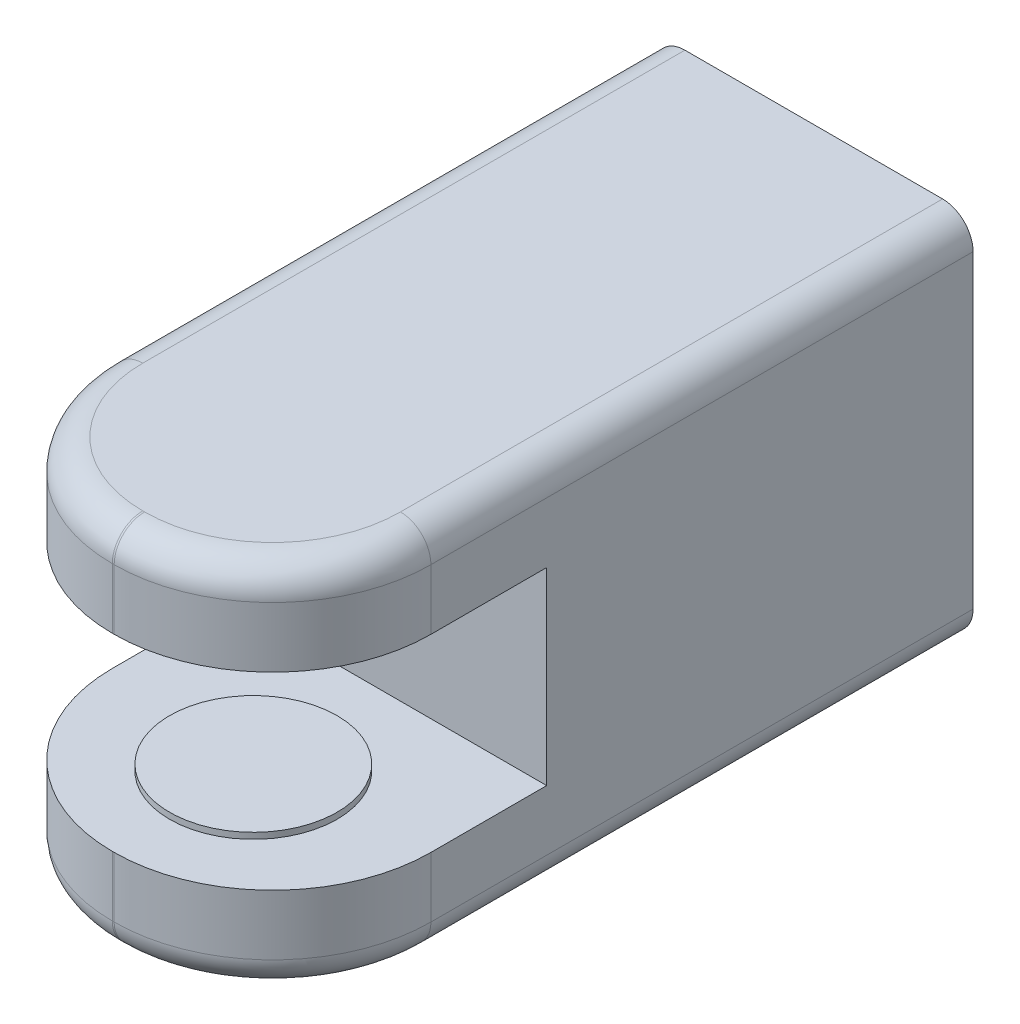
ISO-10303-21;
HEADER;
FILE_DESCRIPTION(('STEP AP214'),'2;1');
FILE_NAME('part.step','',(''),(''),'','','');
FILE_SCHEMA(('AUTOMOTIVE_DESIGN { 1 0 10303 214 1 1 1 1 }'));
ENDSEC;
DATA;
#1=APPLICATION_CONTEXT('core data for automotive mechanical design processes');
#2=APPLICATION_PROTOCOL_DEFINITION('international standard','automotive_design',2000,#1);
#3=PRODUCT_CONTEXT('',#1,'mechanical');
#4=PRODUCT('Part','Part','',(#3));
#5=PRODUCT_RELATED_PRODUCT_CATEGORY('part','',(#4));
#6=PRODUCT_DEFINITION_FORMATION('','',#4);
#7=PRODUCT_DEFINITION_CONTEXT('part definition',#1,'design');
#8=PRODUCT_DEFINITION('design','',#6,#7);
#9=PRODUCT_DEFINITION_SHAPE('','',#8);
#10=(LENGTH_UNIT() NAMED_UNIT(*) SI_UNIT(.MILLI.,.METRE.));
#11=(NAMED_UNIT(*) PLANE_ANGLE_UNIT() SI_UNIT($,.RADIAN.));
#12=(NAMED_UNIT(*) SI_UNIT($,.STERADIAN.) SOLID_ANGLE_UNIT());
#13=UNCERTAINTY_MEASURE_WITH_UNIT(LENGTH_MEASURE(1.E-05),#10,'distance_accuracy_value','');
#14=(GEOMETRIC_REPRESENTATION_CONTEXT(3) GLOBAL_UNCERTAINTY_ASSIGNED_CONTEXT((#13)) GLOBAL_UNIT_ASSIGNED_CONTEXT((#10,
#11,#12)) REPRESENTATION_CONTEXT('',''));
#15=CARTESIAN_POINT('',(0.,0.,0.));
#16=DIRECTION('',(0.,0.,1.));
#17=DIRECTION('',(1.,0.,0.));
#18=AXIS2_PLACEMENT_3D('',#15,#16,#17);
#19=CARTESIAN_POINT('',(52.305,60.805,3.00000000000002));
#20=DIRECTION('',(-1.,0.,0.));
#21=DIRECTION('',(0.,0.,1.));
#22=AXIS2_PLACEMENT_3D('',#19,#20,#21);
#23=PLANE('',#22);
#24=DIRECTION('',(0.,0.,-1.));
#25=VECTOR('',#24,1.);
#26=CARTESIAN_POINT('',(52.305,-31.,143.));
#27=LINE('',#26,#25);
#28=CARTESIAN_POINT('',(52.305,-31.,181.));
#29=VERTEX_POINT('',#28);
#30=CARTESIAN_POINT('',(52.305,-31.,143.));
#31=VERTEX_POINT('',#30);
#32=EDGE_CURVE('E160',#29,#31,#27,.T.);
#33=ORIENTED_EDGE('',*,*,#32,.F.);
#34=DIRECTION('',(0.,-1.,0.));
#35=VECTOR('',#34,1.);
#36=CARTESIAN_POINT('',(52.305,60.805,181.));
#37=LINE('',#36,#35);
#38=CARTESIAN_POINT('',(52.305,-50.805,181.));
#39=VERTEX_POINT('',#38);
#40=EDGE_CURVE('E193',#29,#39,#37,.T.);
#41=ORIENTED_EDGE('',*,*,#40,.T.);
#42=DIRECTION('',(0.,0.,-1.));
#43=VECTOR('',#42,1.);
#44=CARTESIAN_POINT('',(52.305,-50.805,3.00000000000002));
#45=LINE('',#44,#43);
#46=CARTESIAN_POINT('',(52.305,-50.805,3.00000000000002));
#47=VERTEX_POINT('',#46);
#48=EDGE_CURVE('E243',#39,#47,#45,.T.);
#49=ORIENTED_EDGE('',*,*,#48,.T.);
#50=DIRECTION('',(0.,-1.,0.));
#51=VECTOR('',#50,1.);
#52=CARTESIAN_POINT('',(52.305,60.805,3.00000000000002));
#53=LINE('',#52,#51);
#54=CARTESIAN_POINT('',(52.305,50.805,3.00000000000002));
#55=VERTEX_POINT('',#54);
#56=EDGE_CURVE('E215',#55,#47,#53,.T.);
#57=ORIENTED_EDGE('',*,*,#56,.F.);
#58=DIRECTION('',(0.,0.,-1.));
#59=VECTOR('',#58,1.);
#60=CARTESIAN_POINT('',(52.305,50.805,3.00000000000002));
#61=LINE('',#60,#59);
#62=CARTESIAN_POINT('',(52.305,50.805,181.));
#63=VERTEX_POINT('',#62);
#64=EDGE_CURVE('E246',#55,#63,#61,.F.);
#65=ORIENTED_EDGE('',*,*,#64,.T.);
#66=CARTESIAN_POINT('',(52.305,31.,181.));
#67=VERTEX_POINT('',#66);
#68=EDGE_CURVE('E198',#63,#67,#37,.T.);
#69=ORIENTED_EDGE('',*,*,#68,.T.);
#70=DIRECTION('',(0.,0.,-1.));
#71=VECTOR('',#70,1.);
#72=CARTESIAN_POINT('',(52.305,31.,143.));
#73=LINE('',#72,#71);
#74=CARTESIAN_POINT('',(52.305,31.,143.));
#75=VERTEX_POINT('',#74);
#76=EDGE_CURVE('E48',#67,#75,#73,.T.);
#77=ORIENTED_EDGE('',*,*,#76,.T.);
#78=DIRECTION('',(0.,1.,0.));
#79=VECTOR('',#78,1.);
#80=CARTESIAN_POINT('',(52.305,-31.,143.));
#81=LINE('',#80,#79);
#82=EDGE_CURVE('E175',#31,#75,#81,.T.);
#83=ORIENTED_EDGE('',*,*,#82,.F.);
#84=EDGE_LOOP('',(#33,#41,#49,#57,#65,#69,#77,#83));
#85=FACE_BOUND('',#84,.T.);
#86=ADVANCED_FACE('F33',(#85),#23,.F.);
#87=CARTESIAN_POINT('',(-52.305,60.805,3.00000000000002));
#88=DIRECTION('',(1.,0.,0.));
#89=DIRECTION('',(0.,0.,-1.));
#90=AXIS2_PLACEMENT_3D('',#87,#88,#89);
#91=PLANE('',#90);
#92=DIRECTION('',(0.,0.,1.));
#93=VECTOR('',#92,1.);
#94=CARTESIAN_POINT('',(-52.305,-31.,143.));
#95=LINE('',#94,#93);
#96=CARTESIAN_POINT('',(-52.305,-31.,143.));
#97=VERTEX_POINT('',#96);
#98=CARTESIAN_POINT('',(-52.305,-31.,181.));
#99=VERTEX_POINT('',#98);
#100=EDGE_CURVE('E317',#97,#99,#95,.T.);
#101=ORIENTED_EDGE('',*,*,#100,.F.);
#102=DIRECTION('',(0.,1.,0.));
#103=VECTOR('',#102,1.);
#104=CARTESIAN_POINT('',(-52.305,-31.,143.));
#105=LINE('',#104,#103);
#106=CARTESIAN_POINT('',(-52.305,31.,143.));
#107=VERTEX_POINT('',#106);
#108=EDGE_CURVE('E177',#97,#107,#105,.T.);
#109=ORIENTED_EDGE('',*,*,#108,.T.);
#110=DIRECTION('',(0.,0.,1.));
#111=VECTOR('',#110,1.);
#112=CARTESIAN_POINT('',(-52.305,31.,143.));
#113=LINE('',#112,#111);
#114=CARTESIAN_POINT('',(-52.305,31.,181.));
#115=VERTEX_POINT('',#114);
#116=EDGE_CURVE('E310',#107,#115,#113,.T.);
#117=ORIENTED_EDGE('',*,*,#116,.T.);
#118=DIRECTION('',(0.,-1.,0.));
#119=VECTOR('',#118,1.);
#120=CARTESIAN_POINT('',(-52.305,60.805,181.));
#121=LINE('',#120,#119);
#122=CARTESIAN_POINT('',(-52.305,50.805,181.));
#123=VERTEX_POINT('',#122);
#124=EDGE_CURVE('E209',#123,#115,#121,.T.);
#125=ORIENTED_EDGE('',*,*,#124,.F.);
#126=DIRECTION('',(0.,0.,1.));
#127=VECTOR('',#126,1.);
#128=CARTESIAN_POINT('',(-52.305,50.805,3.00000000000002));
#129=LINE('',#128,#127);
#130=CARTESIAN_POINT('',(-52.305,50.805,3.00000000000002));
#131=VERTEX_POINT('',#130);
#132=EDGE_CURVE('E275',#123,#131,#129,.F.);
#133=ORIENTED_EDGE('',*,*,#132,.T.);
#134=DIRECTION('',(0.,-1.,0.));
#135=VECTOR('',#134,1.);
#136=CARTESIAN_POINT('',(-52.305,60.805,3.00000000000002));
#137=LINE('',#136,#135);
#138=CARTESIAN_POINT('',(-52.305,-50.805,3.00000000000002));
#139=VERTEX_POINT('',#138);
#140=EDGE_CURVE('E212',#131,#139,#137,.T.);
#141=ORIENTED_EDGE('',*,*,#140,.T.);
#142=DIRECTION('',(0.,0.,1.));
#143=VECTOR('',#142,1.);
#144=CARTESIAN_POINT('',(-52.305,-50.805,181.));
#145=LINE('',#144,#143);
#146=CARTESIAN_POINT('',(-52.305,-50.805,181.));
#147=VERTEX_POINT('',#146);
#148=EDGE_CURVE('E272',#139,#147,#145,.T.);
#149=ORIENTED_EDGE('',*,*,#148,.T.);
#150=EDGE_CURVE('E208',#99,#147,#121,.T.);
#151=ORIENTED_EDGE('',*,*,#150,.F.);
#152=EDGE_LOOP('',(#101,#109,#117,#125,#133,#141,#149,#151));
#153=FACE_BOUND('',#152,.T.);
#154=ADVANCED_FACE('F318',(#153),#91,.F.);
#155=CARTESIAN_POINT('',(-0.304999999999979,60.805,181.));
#156=DIRECTION('',(0.,-1.,0.));
#157=DIRECTION('',(0.,0.,-1.));
#158=AXIS2_PLACEMENT_3D('',#155,#156,#157);
#159=CYLINDRICAL_SURFACE('',#158,52.);
#160=CARTESIAN_POINT('',(-0.304999999999979,-31.,181.));
#161=DIRECTION('',(0.,1.,0.));
#162=DIRECTION('',(0.,0.,1.));
#163=AXIS2_PLACEMENT_3D('',#160,#161,#162);
#164=CIRCLE('',#163,52.);
#165=CARTESIAN_POINT('',(-0.304999999999604,-31.,233.));
#166=VERTEX_POINT('',#165);
#167=EDGE_CURVE('E187',#99,#166,#164,.T.);
#168=ORIENTED_EDGE('',*,*,#167,.F.);
#169=ORIENTED_EDGE('',*,*,#150,.T.);
#170=CARTESIAN_POINT('',(-0.304999999999979,-50.805,181.));
#171=DIRECTION('',(0.,-1.,0.));
#172=DIRECTION('',(0.,0.,-1.));
#173=AXIS2_PLACEMENT_3D('',#170,#171,#172);
#174=CIRCLE('',#173,52.);
#175=CARTESIAN_POINT('',(-0.304999999999603,-50.805,233.));
#176=VERTEX_POINT('',#175);
#177=EDGE_CURVE('E258',#147,#176,#174,.F.);
#178=ORIENTED_EDGE('',*,*,#177,.T.);
#179=DIRECTION('',(0.,-1.,0.));
#180=VECTOR('',#179,1.);
#181=CARTESIAN_POINT('',(-0.304999999999603,60.805,233.));
#182=LINE('',#181,#180);
#183=EDGE_CURVE('E204',#166,#176,#182,.T.);
#184=ORIENTED_EDGE('',*,*,#183,.F.);
#185=EDGE_LOOP('',(#168,#169,#178,#184));
#186=FACE_BOUND('',#185,.T.);
#187=ADVANCED_FACE('F382',(#186),#159,.T.);
#188=CARTESIAN_POINT('',(0.304999999999611,60.805,233.));
#189=DIRECTION('',(0.,0.,-1.));
#190=DIRECTION('',(-1.,0.,0.));
#191=AXIS2_PLACEMENT_3D('',#188,#189,#190);
#192=PLANE('',#191);
#193=DIRECTION('',(1.,0.,0.));
#194=VECTOR('',#193,1.);
#195=CARTESIAN_POINT('',(-52.305,-31.,233.));
#196=LINE('',#195,#194);
#197=CARTESIAN_POINT('',(0.304999999999979,-31.,233.));
#198=VERTEX_POINT('',#197);
#199=EDGE_CURVE('E170',#166,#198,#196,.T.);
#200=ORIENTED_EDGE('',*,*,#199,.F.);
#201=ORIENTED_EDGE('',*,*,#183,.T.);
#202=DIRECTION('',(1.,0.,0.));
#203=VECTOR('',#202,1.);
#204=CARTESIAN_POINT('',(0.304999999999611,-50.805,233.));
#205=LINE('',#204,#203);
#206=CARTESIAN_POINT('',(0.304999999999611,-50.805,233.));
#207=VERTEX_POINT('',#206);
#208=EDGE_CURVE('E253',#176,#207,#205,.T.);
#209=ORIENTED_EDGE('',*,*,#208,.T.);
#210=DIRECTION('',(0.,-1.,0.));
#211=VECTOR('',#210,1.);
#212=CARTESIAN_POINT('',(0.304999999999611,60.805,233.));
#213=LINE('',#212,#211);
#214=EDGE_CURVE('E200',#198,#207,#213,.T.);
#215=ORIENTED_EDGE('',*,*,#214,.F.);
#216=EDGE_LOOP('',(#200,#201,#209,#215));
#217=FACE_BOUND('',#216,.T.);
#218=ADVANCED_FACE('F386',(#217),#192,.F.);
#219=CARTESIAN_POINT('',(0.304999999999979,60.805,181.));
#220=DIRECTION('',(0.,-1.,0.));
#221=DIRECTION('',(0.,0.,-1.));
#222=AXIS2_PLACEMENT_3D('',#219,#220,#221);
#223=CYLINDRICAL_SURFACE('',#222,52.);
#224=CARTESIAN_POINT('',(0.304999999999979,-31.,181.));
#225=DIRECTION('',(0.,1.,0.));
#226=DIRECTION('',(0.,0.,1.));
#227=AXIS2_PLACEMENT_3D('',#224,#225,#226);
#228=CIRCLE('',#227,52.);
#229=EDGE_CURVE('E166',#198,#29,#228,.T.);
#230=ORIENTED_EDGE('',*,*,#229,.F.);
#231=ORIENTED_EDGE('',*,*,#214,.T.);
#232=CARTESIAN_POINT('',(0.304999999999979,-50.805,181.));
#233=DIRECTION('',(0.,-1.,0.));
#234=DIRECTION('',(0.,0.,-1.));
#235=AXIS2_PLACEMENT_3D('',#232,#233,#234);
#236=CIRCLE('',#235,52.);
#237=EDGE_CURVE('E248',#207,#39,#236,.F.);
#238=ORIENTED_EDGE('',*,*,#237,.T.);
#239=ORIENTED_EDGE('',*,*,#40,.F.);
#240=EDGE_LOOP('',(#230,#231,#238,#239));
#241=FACE_BOUND('',#240,.T.);
#242=ADVANCED_FACE('F389',(#241),#223,.T.);
#243=CARTESIAN_POINT('',(0.,0.,3.));
#244=DIRECTION('',(0.,0.,-1.));
#245=DIRECTION('',(-1.,0.,0.));
#246=AXIS2_PLACEMENT_3D('',#243,#244,#245);
#247=CYLINDRICAL_SURFACE('',#246,38.5);
#248=CARTESIAN_POINT('',(0.,0.,3.));
#249=DIRECTION('',(0.,0.,1.));
#250=DIRECTION('',(1.,0.,0.));
#251=AXIS2_PLACEMENT_3D('',#248,#249,#250);
#252=CIRCLE('',#251,38.5);
#253=CARTESIAN_POINT('',(38.5,0.,3.));
#254=VERTEX_POINT('',#253);
#255=EDGE_CURVE('E219',#254,#254,#252,.T.);
#256=ORIENTED_EDGE('',*,*,#255,.F.);
#257=EDGE_LOOP('',(#256));
#258=FACE_BOUND('',#257,.T.);
#259=CARTESIAN_POINT('',(0.,0.,0.));
#260=DIRECTION('',(0.,0.,1.));
#261=DIRECTION('',(1.,0.,0.));
#262=AXIS2_PLACEMENT_3D('',#259,#260,#261);
#263=CIRCLE('',#262,38.5);
#264=CARTESIAN_POINT('',(38.5,0.,0.));
#265=VERTEX_POINT('',#264);
#266=EDGE_CURVE('E218',#265,#265,#263,.T.);
#267=ORIENTED_EDGE('',*,*,#266,.T.);
#268=EDGE_LOOP('',(#267));
#269=FACE_BOUND('',#268,.T.);
#270=ADVANCED_FACE('F419',(#258,#269),#247,.T.);
#271=CARTESIAN_POINT('',(0.,0.,0.));
#272=DIRECTION('',(0.,0.,1.));
#273=DIRECTION('',(1.,0.,0.));
#274=AXIS2_PLACEMENT_3D('',#271,#272,#273);
#275=PLANE('',#274);
#276=ORIENTED_EDGE('',*,*,#266,.F.);
#277=EDGE_LOOP('',(#276));
#278=FACE_BOUND('',#277,.T.);
#279=ADVANCED_FACE('F416',(#278),#275,.F.);
#280=CARTESIAN_POINT('',(52.305,60.805,3.00000000000002));
#281=DIRECTION('',(0.,0.,1.));
#282=DIRECTION('',(1.,0.,0.));
#283=AXIS2_PLACEMENT_3D('',#280,#281,#282);
#284=PLANE('',#283);
#285=ORIENTED_EDGE('',*,*,#255,.T.);
#286=EDGE_LOOP('',(#285));
#287=FACE_BOUND('',#286,.T.);
#288=DIRECTION('',(-1.,0.,0.));
#289=VECTOR('',#288,1.);
#290=CARTESIAN_POINT('',(52.305,60.805,3.00000000000002));
#291=LINE('',#290,#289);
#292=CARTESIAN_POINT('',(42.305,60.805,3.00000000000002));
#293=VERTEX_POINT('',#292);
#294=CARTESIAN_POINT('',(-42.305,60.805,3.00000000000002));
#295=VERTEX_POINT('',#294);
#296=EDGE_CURVE('E190',#293,#295,#291,.T.);
#297=ORIENTED_EDGE('',*,*,#296,.F.);
#298=CARTESIAN_POINT('',(42.305,50.805,3.00000000000003));
#299=DIRECTION('',(0.,0.,1.));
#300=DIRECTION('',(1.,0.,0.));
#301=AXIS2_PLACEMENT_3D('',#298,#299,#300);
#302=CIRCLE('',#301,10.);
#303=EDGE_CURVE('E241',#293,#55,#302,.F.);
#304=ORIENTED_EDGE('',*,*,#303,.T.);
#305=ORIENTED_EDGE('',*,*,#56,.T.);
#306=CARTESIAN_POINT('',(42.305,-50.805,3.00000000000002));
#307=DIRECTION('',(0.,0.,1.));
#308=DIRECTION('',(1.,0.,0.));
#309=AXIS2_PLACEMENT_3D('',#306,#307,#308);
#310=CIRCLE('',#309,10.);
#311=CARTESIAN_POINT('',(42.305,-60.805,3.00000000000002));
#312=VERTEX_POINT('',#311);
#313=EDGE_CURVE('E239',#47,#312,#310,.F.);
#314=ORIENTED_EDGE('',*,*,#313,.T.);
#315=DIRECTION('',(-1.,0.,0.));
#316=VECTOR('',#315,1.);
#317=CARTESIAN_POINT('',(52.305,-60.805,3.00000000000002));
#318=LINE('',#317,#316);
#319=CARTESIAN_POINT('',(-42.305,-60.805,3.00000000000002));
#320=VERTEX_POINT('',#319);
#321=EDGE_CURVE('E194',#312,#320,#318,.T.);
#322=ORIENTED_EDGE('',*,*,#321,.T.);
#323=CARTESIAN_POINT('',(-42.305,-50.805,3.00000000000002));
#324=DIRECTION('',(0.,0.,1.));
#325=DIRECTION('',(1.,0.,0.));
#326=AXIS2_PLACEMENT_3D('',#323,#324,#325);
#327=CIRCLE('',#326,10.);
#328=EDGE_CURVE('E235',#320,#139,#327,.F.);
#329=ORIENTED_EDGE('',*,*,#328,.T.);
#330=ORIENTED_EDGE('',*,*,#140,.F.);
#331=CARTESIAN_POINT('',(-42.305,50.805,3.00000000000003));
#332=DIRECTION('',(0.,0.,1.));
#333=DIRECTION('',(1.,0.,0.));
#334=AXIS2_PLACEMENT_3D('',#331,#332,#333);
#335=CIRCLE('',#334,10.);
#336=EDGE_CURVE('E237',#131,#295,#335,.F.);
#337=ORIENTED_EDGE('',*,*,#336,.T.);
#338=EDGE_LOOP('',(#297,#304,#305,#314,#322,#329,#330,#337));
#339=FACE_BOUND('',#338,.T.);
#340=ADVANCED_FACE('F351',(#287,#339),#284,.F.);
#341=ORIENTED_EDGE('',*,*,#124,.T.);
#342=CARTESIAN_POINT('',(-0.304999999999979,31.,181.));
#343=DIRECTION('',(0.,1.,0.));
#344=DIRECTION('',(0.,0.,1.));
#345=AXIS2_PLACEMENT_3D('',#342,#343,#344);
#346=CIRCLE('',#345,52.);
#347=CARTESIAN_POINT('',(-0.304999999999604,31.,233.));
#348=VERTEX_POINT('',#347);
#349=EDGE_CURVE('E181',#115,#348,#346,.T.);
#350=ORIENTED_EDGE('',*,*,#349,.T.);
#351=CARTESIAN_POINT('',(-0.304999999999603,50.805,233.));
#352=VERTEX_POINT('',#351);
#353=EDGE_CURVE('E205',#352,#348,#182,.T.);
#354=ORIENTED_EDGE('',*,*,#353,.F.);
#355=CARTESIAN_POINT('',(-0.304999999999979,50.805,181.));
#356=DIRECTION('',(0.,-1.,0.));
#357=DIRECTION('',(0.,0.,-1.));
#358=AXIS2_PLACEMENT_3D('',#355,#356,#357);
#359=CIRCLE('',#358,52.);
#360=EDGE_CURVE('E261',#352,#123,#359,.T.);
#361=ORIENTED_EDGE('',*,*,#360,.T.);
#362=EDGE_LOOP('',(#341,#350,#354,#361));
#363=FACE_BOUND('',#362,.T.);
#364=ADVANCED_FACE('F368',(#363),#159,.T.);
#365=ORIENTED_EDGE('',*,*,#353,.T.);
#366=DIRECTION('',(1.,0.,0.));
#367=VECTOR('',#366,1.);
#368=CARTESIAN_POINT('',(-52.305,31.,233.));
#369=LINE('',#368,#367);
#370=CARTESIAN_POINT('',(0.304999999999979,31.,233.));
#371=VERTEX_POINT('',#370);
#372=EDGE_CURVE('E314',#348,#371,#369,.T.);
#373=ORIENTED_EDGE('',*,*,#372,.T.);
#374=CARTESIAN_POINT('',(0.304999999999611,50.805,233.));
#375=VERTEX_POINT('',#374);
#376=EDGE_CURVE('E201',#375,#371,#213,.T.);
#377=ORIENTED_EDGE('',*,*,#376,.F.);
#378=DIRECTION('',(1.,0.,0.));
#379=VECTOR('',#378,1.);
#380=CARTESIAN_POINT('',(0.304999999999611,50.805,233.));
#381=LINE('',#380,#379);
#382=EDGE_CURVE('E256',#375,#352,#381,.F.);
#383=ORIENTED_EDGE('',*,*,#382,.T.);
#384=EDGE_LOOP('',(#365,#373,#377,#383));
#385=FACE_BOUND('',#384,.T.);
#386=ADVANCED_FACE('F330',(#385),#192,.F.);
#387=ORIENTED_EDGE('',*,*,#376,.T.);
#388=CARTESIAN_POINT('',(0.304999999999979,31.,181.));
#389=DIRECTION('',(0.,1.,0.));
#390=DIRECTION('',(0.,0.,1.));
#391=AXIS2_PLACEMENT_3D('',#388,#389,#390);
#392=CIRCLE('',#391,52.);
#393=EDGE_CURVE('E277',#371,#67,#392,.T.);
#394=ORIENTED_EDGE('',*,*,#393,.T.);
#395=ORIENTED_EDGE('',*,*,#68,.F.);
#396=CARTESIAN_POINT('',(0.304999999999979,50.805,181.));
#397=DIRECTION('',(0.,-1.,0.));
#398=DIRECTION('',(0.,0.,-1.));
#399=AXIS2_PLACEMENT_3D('',#396,#397,#398);
#400=CIRCLE('',#399,52.);
#401=EDGE_CURVE('E251',#63,#375,#400,.T.);
#402=ORIENTED_EDGE('',*,*,#401,.T.);
#403=EDGE_LOOP('',(#387,#394,#395,#402));
#404=FACE_BOUND('',#403,.T.);
#405=ADVANCED_FACE('F334',(#404),#223,.T.);
#406=CARTESIAN_POINT('',(0.304999999999979,60.805,181.));
#407=DIRECTION('',(0.,-1.,0.));
#408=DIRECTION('',(0.,0.,-1.));
#409=AXIS2_PLACEMENT_3D('',#406,#407,#408);
#410=PLANE('',#409);
#411=CARTESIAN_POINT('',(0.304999999999979,60.805,181.));
#412=DIRECTION('',(0.,-1.,0.));
#413=DIRECTION('',(0.,0.,-1.));
#414=AXIS2_PLACEMENT_3D('',#411,#412,#413);
#415=CIRCLE('',#414,42.);
#416=CARTESIAN_POINT('',(0.304999999999682,60.805,223.));
#417=VERTEX_POINT('',#416);
#418=CARTESIAN_POINT('',(42.305,60.805,181.));
#419=VERTEX_POINT('',#418);
#420=EDGE_CURVE('E230',#417,#419,#415,.F.);
#421=ORIENTED_EDGE('',*,*,#420,.T.);
#422=DIRECTION('',(0.,0.,-1.));
#423=VECTOR('',#422,1.);
#424=CARTESIAN_POINT('',(42.305,60.805,181.));
#425=LINE('',#424,#423);
#426=EDGE_CURVE('E232',#419,#293,#425,.T.);
#427=ORIENTED_EDGE('',*,*,#426,.T.);
#428=ORIENTED_EDGE('',*,*,#296,.T.);
#429=DIRECTION('',(0.,0.,1.));
#430=VECTOR('',#429,1.);
#431=CARTESIAN_POINT('',(-42.305,60.805,181.));
#432=LINE('',#431,#430);
#433=CARTESIAN_POINT('',(-42.305,60.805,181.));
#434=VERTEX_POINT('',#433);
#435=EDGE_CURVE('E222',#295,#434,#432,.T.);
#436=ORIENTED_EDGE('',*,*,#435,.T.);
#437=CARTESIAN_POINT('',(-0.304999999999979,60.805,181.));
#438=DIRECTION('',(0.,-1.,0.));
#439=DIRECTION('',(0.,0.,-1.));
#440=AXIS2_PLACEMENT_3D('',#437,#438,#439);
#441=CIRCLE('',#440,42.);
#442=CARTESIAN_POINT('',(-0.304999999999603,60.805,223.));
#443=VERTEX_POINT('',#442);
#444=EDGE_CURVE('E226',#434,#443,#441,.F.);
#445=ORIENTED_EDGE('',*,*,#444,.T.);
#446=DIRECTION('',(1.,0.,0.));
#447=VECTOR('',#446,1.);
#448=CARTESIAN_POINT('',(0.304999999999979,60.805,223.));
#449=LINE('',#448,#447);
#450=EDGE_CURVE('E228',#443,#417,#449,.T.);
#451=ORIENTED_EDGE('',*,*,#450,.T.);
#452=EDGE_LOOP('',(#421,#427,#428,#436,#445,#451));
#453=FACE_BOUND('',#452,.T.);
#454=ADVANCED_FACE('F348',(#453),#410,.F.);
#455=CARTESIAN_POINT('',(0.304999999999979,-60.805,181.));
#456=DIRECTION('',(0.,-1.,0.));
#457=DIRECTION('',(0.,0.,-1.));
#458=AXIS2_PLACEMENT_3D('',#455,#456,#457);
#459=PLANE('',#458);
#460=ORIENTED_EDGE('',*,*,#321,.F.);
#461=DIRECTION('',(0.,0.,-1.));
#462=VECTOR('',#461,1.);
#463=CARTESIAN_POINT('',(42.305,-60.805,181.));
#464=LINE('',#463,#462);
#465=CARTESIAN_POINT('',(42.305,-60.805,181.));
#466=VERTEX_POINT('',#465);
#467=EDGE_CURVE('E56',#312,#466,#464,.F.);
#468=ORIENTED_EDGE('',*,*,#467,.T.);
#469=CARTESIAN_POINT('',(0.304999999999979,-60.805,181.));
#470=DIRECTION('',(0.,-1.,0.));
#471=DIRECTION('',(0.,0.,-1.));
#472=AXIS2_PLACEMENT_3D('',#469,#470,#471);
#473=CIRCLE('',#472,42.);
#474=CARTESIAN_POINT('',(0.304999999999682,-60.805,223.));
#475=VERTEX_POINT('',#474);
#476=EDGE_CURVE('E269',#466,#475,#473,.T.);
#477=ORIENTED_EDGE('',*,*,#476,.T.);
#478=DIRECTION('',(1.,0.,0.));
#479=VECTOR('',#478,1.);
#480=CARTESIAN_POINT('',(-0.304999999999603,-60.805,223.));
#481=LINE('',#480,#479);
#482=CARTESIAN_POINT('',(-0.304999999999603,-60.805,223.));
#483=VERTEX_POINT('',#482);
#484=EDGE_CURVE('E267',#475,#483,#481,.F.);
#485=ORIENTED_EDGE('',*,*,#484,.T.);
#486=CARTESIAN_POINT('',(-0.304999999999979,-60.805,181.));
#487=DIRECTION('',(0.,-1.,0.));
#488=DIRECTION('',(0.,0.,-1.));
#489=AXIS2_PLACEMENT_3D('',#486,#487,#488);
#490=CIRCLE('',#489,42.);
#491=CARTESIAN_POINT('',(-42.305,-60.805,181.));
#492=VERTEX_POINT('',#491);
#493=EDGE_CURVE('E265',#483,#492,#490,.T.);
#494=ORIENTED_EDGE('',*,*,#493,.T.);
#495=DIRECTION('',(0.,0.,1.));
#496=VECTOR('',#495,1.);
#497=CARTESIAN_POINT('',(-42.305,-60.805,3.00000000000002));
#498=LINE('',#497,#496);
#499=EDGE_CURVE('E263',#492,#320,#498,.F.);
#500=ORIENTED_EDGE('',*,*,#499,.T.);
#501=EDGE_LOOP('',(#460,#468,#477,#485,#494,#500));
#502=FACE_BOUND('',#501,.T.);
#503=ADVANCED_FACE('F394',(#502),#459,.T.);
#504=CARTESIAN_POINT('',(-42.305,50.805,181.));
#505=DIRECTION('',(0.,0.,1.));
#506=DIRECTION('',(1.,0.,0.));
#507=AXIS2_PLACEMENT_3D('',#504,#505,#506);
#508=CYLINDRICAL_SURFACE('',#507,10.);
#509=ORIENTED_EDGE('',*,*,#336,.F.);
#510=ORIENTED_EDGE('',*,*,#132,.F.);
#511=CARTESIAN_POINT('',(-42.305,50.805,181.));
#512=DIRECTION('',(0.,0.,1.));
#513=DIRECTION('',(1.,0.,0.));
#514=AXIS2_PLACEMENT_3D('',#511,#512,#513);
#515=CIRCLE('',#514,10.);
#516=EDGE_CURVE('E197',#434,#123,#515,.T.);
#517=ORIENTED_EDGE('',*,*,#516,.F.);
#518=ORIENTED_EDGE('',*,*,#435,.F.);
#519=EDGE_LOOP('',(#509,#510,#517,#518));
#520=FACE_BOUND('',#519,.T.);
#521=ADVANCED_FACE('F357',(#520),#508,.T.);
#522=CARTESIAN_POINT('',(-0.304999999999979,50.805,181.));
#523=DIRECTION('',(0.,-1.,0.));
#524=DIRECTION('',(0.,0.,-1.));
#525=AXIS2_PLACEMENT_3D('',#522,#523,#524);
#526=TOROIDAL_SURFACE('',#525,42.,10.);
#527=ORIENTED_EDGE('',*,*,#516,.T.);
#528=ORIENTED_EDGE('',*,*,#360,.F.);
#529=CARTESIAN_POINT('',(-0.304999999999603,50.805,223.));
#530=DIRECTION('',(1.,0.,0.));
#531=DIRECTION('',(0.,0.,-1.));
#532=AXIS2_PLACEMENT_3D('',#529,#530,#531);
#533=CIRCLE('',#532,10.);
#534=EDGE_CURVE('E285',#443,#352,#533,.T.);
#535=ORIENTED_EDGE('',*,*,#534,.F.);
#536=ORIENTED_EDGE('',*,*,#444,.F.);
#537=EDGE_LOOP('',(#527,#528,#535,#536));
#538=FACE_BOUND('',#537,.T.);
#539=ADVANCED_FACE('F364',(#538),#526,.T.);
#540=CARTESIAN_POINT('',(0.304999999999979,50.805,223.));
#541=DIRECTION('',(1.,0.,0.));
#542=DIRECTION('',(0.,0.,-1.));
#543=AXIS2_PLACEMENT_3D('',#540,#541,#542);
#544=CYLINDRICAL_SURFACE('',#543,10.);
#545=ORIENTED_EDGE('',*,*,#534,.T.);
#546=ORIENTED_EDGE('',*,*,#382,.F.);
#547=CARTESIAN_POINT('',(0.304999999999682,50.805,223.));
#548=DIRECTION('',(1.,0.,0.));
#549=DIRECTION('',(0.,0.,-1.));
#550=AXIS2_PLACEMENT_3D('',#547,#548,#549);
#551=CIRCLE('',#550,10.);
#552=EDGE_CURVE('E281',#417,#375,#551,.T.);
#553=ORIENTED_EDGE('',*,*,#552,.F.);
#554=ORIENTED_EDGE('',*,*,#450,.F.);
#555=EDGE_LOOP('',(#545,#546,#553,#554));
#556=FACE_BOUND('',#555,.T.);
#557=ADVANCED_FACE('F366',(#556),#544,.T.);
#558=CARTESIAN_POINT('',(0.304999999999979,50.805,181.));
#559=DIRECTION('',(0.,-1.,0.));
#560=DIRECTION('',(0.,0.,-1.));
#561=AXIS2_PLACEMENT_3D('',#558,#559,#560);
#562=TOROIDAL_SURFACE('',#561,42.,10.);
#563=ORIENTED_EDGE('',*,*,#552,.T.);
#564=ORIENTED_EDGE('',*,*,#401,.F.);
#565=CARTESIAN_POINT('',(42.305,50.805,181.));
#566=DIRECTION('',(0.,0.,-1.));
#567=DIRECTION('',(-1.,0.,0.));
#568=AXIS2_PLACEMENT_3D('',#565,#566,#567);
#569=CIRCLE('',#568,10.);
#570=EDGE_CURVE('E278',#419,#63,#569,.T.);
#571=ORIENTED_EDGE('',*,*,#570,.F.);
#572=ORIENTED_EDGE('',*,*,#420,.F.);
#573=EDGE_LOOP('',(#563,#564,#571,#572));
#574=FACE_BOUND('',#573,.T.);
#575=ADVANCED_FACE('F339',(#574),#562,.T.);
#576=CARTESIAN_POINT('',(42.305,50.805,181.));
#577=DIRECTION('',(0.,0.,-1.));
#578=DIRECTION('',(-1.,0.,0.));
#579=AXIS2_PLACEMENT_3D('',#576,#577,#578);
#580=CYLINDRICAL_SURFACE('',#579,10.);
#581=ORIENTED_EDGE('',*,*,#570,.T.);
#582=ORIENTED_EDGE('',*,*,#64,.F.);
#583=ORIENTED_EDGE('',*,*,#303,.F.);
#584=ORIENTED_EDGE('',*,*,#426,.F.);
#585=EDGE_LOOP('',(#581,#582,#583,#584));
#586=FACE_BOUND('',#585,.T.);
#587=ADVANCED_FACE('F345',(#586),#580,.T.);
#588=CARTESIAN_POINT('',(-42.305,-50.805,3.00000000000002));
#589=DIRECTION('',(0.,0.,-1.));
#590=DIRECTION('',(-1.,0.,0.));
#591=AXIS2_PLACEMENT_3D('',#588,#589,#590);
#592=CYLINDRICAL_SURFACE('',#591,10.);
#593=ORIENTED_EDGE('',*,*,#328,.F.);
#594=ORIENTED_EDGE('',*,*,#499,.F.);
#595=CARTESIAN_POINT('',(-42.305,-50.805,181.));
#596=DIRECTION('',(0.,0.,1.));
#597=DIRECTION('',(0.,-1.,0.));
#598=AXIS2_PLACEMENT_3D('',#595,#596,#597);
#599=CIRCLE('',#598,10.);
#600=EDGE_CURVE('E282',#147,#492,#599,.T.);
#601=ORIENTED_EDGE('',*,*,#600,.F.);
#602=ORIENTED_EDGE('',*,*,#148,.F.);
#603=EDGE_LOOP('',(#593,#594,#601,#602));
#604=FACE_BOUND('',#603,.T.);
#605=ADVANCED_FACE('F35',(#604),#592,.T.);
#606=CARTESIAN_POINT('',(-0.304999999999979,-50.805,181.));
#607=DIRECTION('',(0.,-1.,0.));
#608=DIRECTION('',(0.,0.,-1.));
#609=AXIS2_PLACEMENT_3D('',#606,#607,#608);
#610=TOROIDAL_SURFACE('',#609,42.,10.);
#611=ORIENTED_EDGE('',*,*,#600,.T.);
#612=ORIENTED_EDGE('',*,*,#493,.F.);
#613=CARTESIAN_POINT('',(-0.304999999999675,-50.805,223.));
#614=DIRECTION('',(1.,0.,0.));
#615=DIRECTION('',(0.,1.,0.));
#616=AXIS2_PLACEMENT_3D('',#613,#614,#615);
#617=CIRCLE('',#616,10.);
#618=EDGE_CURVE('E295',#176,#483,#617,.T.);
#619=ORIENTED_EDGE('',*,*,#618,.F.);
#620=ORIENTED_EDGE('',*,*,#177,.F.);
#621=EDGE_LOOP('',(#611,#612,#619,#620));
#622=FACE_BOUND('',#621,.T.);
#623=ADVANCED_FACE('F378',(#622),#610,.T.);
#624=CARTESIAN_POINT('',(0.304999999999611,-50.805,223.));
#625=DIRECTION('',(-1.,0.,0.));
#626=DIRECTION('',(0.,0.,1.));
#627=AXIS2_PLACEMENT_3D('',#624,#625,#626);
#628=CYLINDRICAL_SURFACE('',#627,10.);
#629=ORIENTED_EDGE('',*,*,#618,.T.);
#630=ORIENTED_EDGE('',*,*,#484,.F.);
#631=CARTESIAN_POINT('',(0.304999999999611,-50.805,223.));
#632=DIRECTION('',(1.,0.,0.));
#633=DIRECTION('',(0.,1.,0.));
#634=AXIS2_PLACEMENT_3D('',#631,#632,#633);
#635=CIRCLE('',#634,10.);
#636=EDGE_CURVE('E292',#207,#475,#635,.T.);
#637=ORIENTED_EDGE('',*,*,#636,.F.);
#638=ORIENTED_EDGE('',*,*,#208,.F.);
#639=EDGE_LOOP('',(#629,#630,#637,#638));
#640=FACE_BOUND('',#639,.T.);
#641=ADVANCED_FACE('F400',(#640),#628,.T.);
#642=CARTESIAN_POINT('',(0.304999999999979,-50.805,181.));
#643=DIRECTION('',(0.,-1.,0.));
#644=DIRECTION('',(0.,0.,-1.));
#645=AXIS2_PLACEMENT_3D('',#642,#643,#644);
#646=TOROIDAL_SURFACE('',#645,42.,10.);
#647=ORIENTED_EDGE('',*,*,#636,.T.);
#648=ORIENTED_EDGE('',*,*,#476,.F.);
#649=CARTESIAN_POINT('',(42.305,-50.805,181.));
#650=DIRECTION('',(0.,0.,-1.));
#651=DIRECTION('',(-1.,0.,0.));
#652=AXIS2_PLACEMENT_3D('',#649,#650,#651);
#653=CIRCLE('',#652,10.);
#654=EDGE_CURVE('E189',#39,#466,#653,.T.);
#655=ORIENTED_EDGE('',*,*,#654,.F.);
#656=ORIENTED_EDGE('',*,*,#237,.F.);
#657=EDGE_LOOP('',(#647,#648,#655,#656));
#658=FACE_BOUND('',#657,.T.);
#659=ADVANCED_FACE('F397',(#658),#646,.T.);
#660=CARTESIAN_POINT('',(42.305,-50.805,3.00000000000002));
#661=DIRECTION('',(0.,0.,1.));
#662=DIRECTION('',(1.,0.,0.));
#663=AXIS2_PLACEMENT_3D('',#660,#661,#662);
#664=CYLINDRICAL_SURFACE('',#663,10.);
#665=ORIENTED_EDGE('',*,*,#654,.T.);
#666=ORIENTED_EDGE('',*,*,#467,.F.);
#667=ORIENTED_EDGE('',*,*,#313,.F.);
#668=ORIENTED_EDGE('',*,*,#48,.F.);
#669=EDGE_LOOP('',(#665,#666,#667,#668));
#670=FACE_BOUND('',#669,.T.);
#671=ADVANCED_FACE('F395',(#670),#664,.T.);
#672=CARTESIAN_POINT('',(0.,-31.,0.));
#673=DIRECTION('',(0.,1.,0.));
#674=DIRECTION('',(0.,0.,1.));
#675=AXIS2_PLACEMENT_3D('',#672,#673,#674);
#676=PLANE('',#675);
#677=CARTESIAN_POINT('',(0.,-31.,187.));
#678=DIRECTION('',(0.,1.,0.));
#679=DIRECTION('',(0.,0.,1.));
#680=AXIS2_PLACEMENT_3D('',#677,#678,#679);
#681=CIRCLE('',#680,27.5);
#682=CARTESIAN_POINT('',(0.,-31.,214.5));
#683=VERTEX_POINT('',#682);
#684=EDGE_CURVE('E11',#683,#683,#681,.T.);
#685=ORIENTED_EDGE('',*,*,#684,.F.);
#686=EDGE_LOOP('',(#685));
#687=FACE_BOUND('',#686,.T.);
#688=ORIENTED_EDGE('',*,*,#167,.T.);
#689=ORIENTED_EDGE('',*,*,#199,.T.);
#690=ORIENTED_EDGE('',*,*,#229,.T.);
#691=ORIENTED_EDGE('',*,*,#32,.T.);
#692=DIRECTION('',(-1.,0.,0.));
#693=VECTOR('',#692,1.);
#694=CARTESIAN_POINT('',(-52.305,-31.,143.));
#695=LINE('',#694,#693);
#696=EDGE_CURVE('E163',#31,#97,#695,.T.);
#697=ORIENTED_EDGE('',*,*,#696,.T.);
#698=ORIENTED_EDGE('',*,*,#100,.T.);
#699=EDGE_LOOP('',(#688,#689,#690,#691,#697,#698));
#700=FACE_BOUND('',#699,.T.);
#701=ADVANCED_FACE('F162',(#687,#700),#676,.T.);
#702=CARTESIAN_POINT('',(0.,31.,0.));
#703=DIRECTION('',(0.,1.,0.));
#704=DIRECTION('',(0.,0.,1.));
#705=AXIS2_PLACEMENT_3D('',#702,#703,#704);
#706=PLANE('',#705);
#707=CARTESIAN_POINT('',(0.,31.,187.));
#708=DIRECTION('',(0.,1.,0.));
#709=DIRECTION('',(0.,0.,1.));
#710=AXIS2_PLACEMENT_3D('',#707,#708,#709);
#711=CIRCLE('',#710,27.5);
#712=CARTESIAN_POINT('',(0.,31.,214.5));
#713=VERTEX_POINT('',#712);
#714=EDGE_CURVE('E41',#713,#713,#711,.F.);
#715=ORIENTED_EDGE('',*,*,#714,.F.);
#716=EDGE_LOOP('',(#715));
#717=FACE_BOUND('',#716,.T.);
#718=ORIENTED_EDGE('',*,*,#116,.F.);
#719=DIRECTION('',(-1.,0.,0.));
#720=VECTOR('',#719,1.);
#721=CARTESIAN_POINT('',(-52.305,31.,143.));
#722=LINE('',#721,#720);
#723=EDGE_CURVE('E311',#75,#107,#722,.T.);
#724=ORIENTED_EDGE('',*,*,#723,.F.);
#725=ORIENTED_EDGE('',*,*,#76,.F.);
#726=ORIENTED_EDGE('',*,*,#393,.F.);
#727=ORIENTED_EDGE('',*,*,#372,.F.);
#728=ORIENTED_EDGE('',*,*,#349,.F.);
#729=EDGE_LOOP('',(#718,#724,#725,#726,#727,#728));
#730=FACE_BOUND('',#729,.T.);
#731=ADVANCED_FACE('F306',(#717,#730),#706,.F.);
#732=CARTESIAN_POINT('',(-52.305,-31.,143.));
#733=DIRECTION('',(0.,0.,-1.));
#734=DIRECTION('',(-1.,0.,0.));
#735=AXIS2_PLACEMENT_3D('',#732,#733,#734);
#736=PLANE('',#735);
#737=ORIENTED_EDGE('',*,*,#723,.T.);
#738=ORIENTED_EDGE('',*,*,#108,.F.);
#739=ORIENTED_EDGE('',*,*,#696,.F.);
#740=ORIENTED_EDGE('',*,*,#82,.T.);
#741=EDGE_LOOP('',(#737,#738,#739,#740));
#742=FACE_BOUND('',#741,.T.);
#743=ADVANCED_FACE('F174',(#742),#736,.F.);
#744=CARTESIAN_POINT('',(0.,29.,187.));
#745=DIRECTION('',(0.,1.,0.));
#746=DIRECTION('',(0.,0.,1.));
#747=AXIS2_PLACEMENT_3D('',#744,#745,#746);
#748=CYLINDRICAL_SURFACE('',#747,27.5);
#749=CARTESIAN_POINT('',(0.,29.,187.));
#750=DIRECTION('',(0.,-1.,0.));
#751=DIRECTION('',(0.,0.,-1.));
#752=AXIS2_PLACEMENT_3D('',#749,#750,#751);
#753=CIRCLE('',#752,27.5);
#754=CARTESIAN_POINT('',(0.,29.,159.5));
#755=VERTEX_POINT('',#754);
#756=EDGE_CURVE('E315',#755,#755,#753,.T.);
#757=ORIENTED_EDGE('',*,*,#756,.F.);
#758=EDGE_LOOP('',(#757));
#759=FACE_BOUND('',#758,.T.);
#760=ORIENTED_EDGE('',*,*,#714,.T.);
#761=EDGE_LOOP('',(#760));
#762=FACE_BOUND('',#761,.T.);
#763=ADVANCED_FACE('F304',(#759,#762),#748,.T.);
#764=CARTESIAN_POINT('',(0.,29.,187.));
#765=DIRECTION('',(0.,-1.,0.));
#766=DIRECTION('',(0.,0.,-1.));
#767=AXIS2_PLACEMENT_3D('',#764,#765,#766);
#768=PLANE('',#767);
#769=ORIENTED_EDGE('',*,*,#756,.T.);
#770=EDGE_LOOP('',(#769));
#771=FACE_BOUND('',#770,.T.);
#772=ADVANCED_FACE('F600',(#771),#768,.T.);
#773=CARTESIAN_POINT('',(0.,-29.,187.));
#774=DIRECTION('',(0.,-1.,0.));
#775=DIRECTION('',(0.,0.,-1.));
#776=AXIS2_PLACEMENT_3D('',#773,#774,#775);
#777=CYLINDRICAL_SURFACE('',#776,27.5);
#778=CARTESIAN_POINT('',(0.,-29.,187.));
#779=DIRECTION('',(0.,-1.,0.));
#780=DIRECTION('',(0.,0.,-1.));
#781=AXIS2_PLACEMENT_3D('',#778,#779,#780);
#782=CIRCLE('',#781,27.5);
#783=CARTESIAN_POINT('',(0.,-29.,159.5));
#784=VERTEX_POINT('',#783);
#785=EDGE_CURVE('E633',#784,#784,#782,.T.);
#786=ORIENTED_EDGE('',*,*,#785,.T.);
#787=EDGE_LOOP('',(#786));
#788=FACE_BOUND('',#787,.T.);
#789=ORIENTED_EDGE('',*,*,#684,.T.);
#790=EDGE_LOOP('',(#789));
#791=FACE_BOUND('',#790,.T.);
#792=ADVANCED_FACE('F607',(#788,#791),#777,.T.);
#793=CARTESIAN_POINT('',(0.,-29.,187.));
#794=DIRECTION('',(0.,1.,0.));
#795=DIRECTION('',(0.,0.,-1.));
#796=AXIS2_PLACEMENT_3D('',#793,#794,#795);
#797=PLANE('',#796);
#798=ORIENTED_EDGE('',*,*,#785,.F.);
#799=EDGE_LOOP('',(#798));
#800=FACE_BOUND('',#799,.T.);
#801=ADVANCED_FACE('F614',(#800),#797,.T.);
#802=CLOSED_SHELL('',(#86,#154,#187,#218,#242,#270,#279,#340,#364,#386,#405,#454,#503,#521,#539,
#557,#575,#587,#605,#623,#641,#659,#671,#701,#731,#743,#763,#772,#792,#801));
#803=MANIFOLD_SOLID_BREP('B2',#802);
#804=ADVANCED_BREP_SHAPE_REPRESENTATION('',(#18,#803),#14);
#805=SHAPE_DEFINITION_REPRESENTATION(#9,#804);
ENDSEC;
END-ISO-10303-21;
